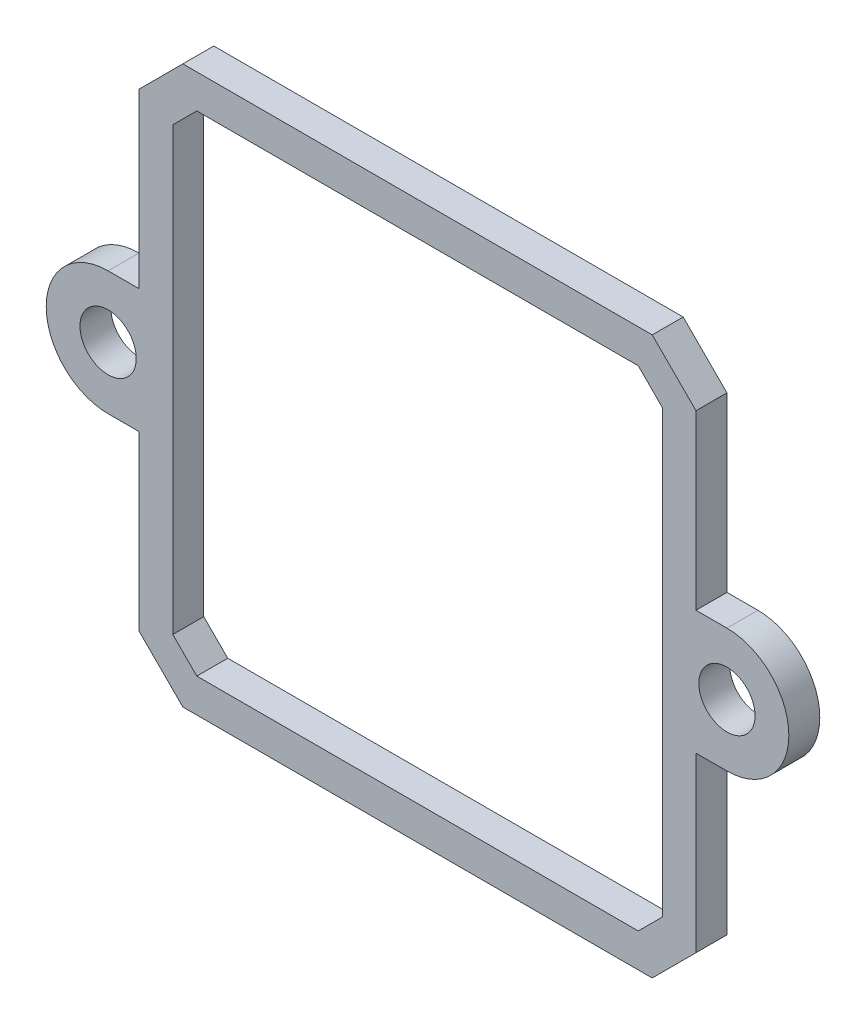
ISO-10303-21;
HEADER;
FILE_DESCRIPTION(('STEP AP214'),'2;1');
FILE_NAME('part.step','',(''),(''),'','','');
FILE_SCHEMA(('AUTOMOTIVE_DESIGN { 1 0 10303 214 1 1 1 1 }'));
ENDSEC;
DATA;
#1=APPLICATION_CONTEXT('core data for automotive mechanical design processes');
#2=APPLICATION_PROTOCOL_DEFINITION('international standard','automotive_design',2000,#1);
#3=PRODUCT_CONTEXT('',#1,'mechanical');
#4=PRODUCT('Part','Part','',(#3));
#5=PRODUCT_RELATED_PRODUCT_CATEGORY('part','',(#4));
#6=PRODUCT_DEFINITION_FORMATION('','',#4);
#7=PRODUCT_DEFINITION_CONTEXT('part definition',#1,'design');
#8=PRODUCT_DEFINITION('design','',#6,#7);
#9=PRODUCT_DEFINITION_SHAPE('','',#8);
#10=(LENGTH_UNIT() NAMED_UNIT(*) SI_UNIT(.MILLI.,.METRE.));
#11=(NAMED_UNIT(*) PLANE_ANGLE_UNIT() SI_UNIT($,.RADIAN.));
#12=(NAMED_UNIT(*) SI_UNIT($,.STERADIAN.) SOLID_ANGLE_UNIT());
#13=UNCERTAINTY_MEASURE_WITH_UNIT(LENGTH_MEASURE(1.E-05),#10,'distance_accuracy_value','');
#14=(GEOMETRIC_REPRESENTATION_CONTEXT(3) GLOBAL_UNCERTAINTY_ASSIGNED_CONTEXT((#13)) GLOBAL_UNIT_ASSIGNED_CONTEXT((#10,
#11,#12)) REPRESENTATION_CONTEXT('',''));
#15=CARTESIAN_POINT('',(0.,0.,0.));
#16=DIRECTION('',(0.,0.,1.));
#17=DIRECTION('',(1.,0.,0.));
#18=AXIS2_PLACEMENT_3D('',#15,#16,#17);
#19=CARTESIAN_POINT('',(0.,-9.9,1.1));
#20=DIRECTION('',(0.,1.,0.));
#21=DIRECTION('',(0.,0.,1.));
#22=AXIS2_PLACEMENT_3D('',#19,#20,#21);
#23=PLANE('',#22);
#24=DIRECTION('',(1.,0.,0.));
#25=VECTOR('',#24,1.);
#26=CARTESIAN_POINT('',(0.,-9.9,0.));
#27=LINE('',#26,#25);
#28=CARTESIAN_POINT('',(-8.34335495461292,-9.9,0.));
#29=VERTEX_POINT('',#28);
#30=CARTESIAN_POINT('',(8.34335495461292,-9.9,0.));
#31=VERTEX_POINT('',#30);
#32=EDGE_CURVE('E264',#29,#31,#27,.T.);
#33=ORIENTED_EDGE('',*,*,#32,.T.);
#34=DIRECTION('',(0.,0.,-1.));
#35=VECTOR('',#34,1.);
#36=CARTESIAN_POINT('',(8.34335495461292,-9.9,1.1));
#37=LINE('',#36,#35);
#38=CARTESIAN_POINT('',(8.34335495461292,-9.9,1.1));
#39=VERTEX_POINT('',#38);
#40=EDGE_CURVE('E11',#39,#31,#37,.T.);
#41=ORIENTED_EDGE('',*,*,#40,.F.);
#42=DIRECTION('',(1.,0.,0.));
#43=VECTOR('',#42,1.);
#44=CARTESIAN_POINT('',(0.,-9.9,1.1));
#45=LINE('',#44,#43);
#46=CARTESIAN_POINT('',(-8.34335495461292,-9.9,1.1));
#47=VERTEX_POINT('',#46);
#48=EDGE_CURVE('E386',#47,#39,#45,.T.);
#49=ORIENTED_EDGE('',*,*,#48,.F.);
#50=DIRECTION('',(0.,0.,-1.));
#51=VECTOR('',#50,1.);
#52=CARTESIAN_POINT('',(-8.34335495461292,-9.9,1.1));
#53=LINE('',#52,#51);
#54=EDGE_CURVE('E309',#47,#29,#53,.T.);
#55=ORIENTED_EDGE('',*,*,#54,.T.);
#56=EDGE_LOOP('',(#33,#41,#49,#55));
#57=FACE_BOUND('',#56,.T.);
#58=ADVANCED_FACE('F35',(#57),#23,.F.);
#59=CARTESIAN_POINT('',(9.12167747730646,-9.12167747730646,1.1));
#60=DIRECTION('',(-0.707106781186548,0.707106781186548,0.));
#61=DIRECTION('',(-0.707106781186548,-0.707106781186548,0.));
#62=AXIS2_PLACEMENT_3D('',#59,#60,#61);
#63=PLANE('',#62);
#64=DIRECTION('',(0.707106781186548,0.707106781186548,0.));
#65=VECTOR('',#64,1.);
#66=CARTESIAN_POINT('',(9.12167747730646,-9.12167747730646,0.));
#67=LINE('',#66,#65);
#68=CARTESIAN_POINT('',(9.9,-8.34335495461292,0.));
#69=VERTEX_POINT('',#68);
#70=EDGE_CURVE('E267',#31,#69,#67,.T.);
#71=ORIENTED_EDGE('',*,*,#70,.T.);
#72=DIRECTION('',(0.,0.,-1.));
#73=VECTOR('',#72,1.);
#74=CARTESIAN_POINT('',(9.9,-8.34335495461292,1.1));
#75=LINE('',#74,#73);
#76=CARTESIAN_POINT('',(9.9,-8.34335495461292,1.1));
#77=VERTEX_POINT('',#76);
#78=EDGE_CURVE('E45',#77,#69,#75,.T.);
#79=ORIENTED_EDGE('',*,*,#78,.F.);
#80=DIRECTION('',(0.707106781186548,0.707106781186548,0.));
#81=VECTOR('',#80,1.);
#82=CARTESIAN_POINT('',(9.12167747730646,-9.12167747730646,1.1));
#83=LINE('',#82,#81);
#84=EDGE_CURVE('E388',#39,#77,#83,.T.);
#85=ORIENTED_EDGE('',*,*,#84,.F.);
#86=ORIENTED_EDGE('',*,*,#40,.T.);
#87=EDGE_LOOP('',(#71,#79,#85,#86));
#88=FACE_BOUND('',#87,.T.);
#89=ADVANCED_FACE('F443',(#88),#63,.F.);
#90=CARTESIAN_POINT('',(9.9,0.,1.1));
#91=DIRECTION('',(1.,0.,0.));
#92=DIRECTION('',(0.,0.,-1.));
#93=AXIS2_PLACEMENT_3D('',#90,#91,#92);
#94=PLANE('',#93);
#95=DIRECTION('',(0.,-1.,0.));
#96=VECTOR('',#95,1.);
#97=CARTESIAN_POINT('',(9.9,0.,0.));
#98=LINE('',#97,#96);
#99=CARTESIAN_POINT('',(9.9,-2.2,0.));
#100=VERTEX_POINT('',#99);
#101=EDGE_CURVE('E270',#100,#69,#98,.T.);
#102=ORIENTED_EDGE('',*,*,#101,.F.);
#103=DIRECTION('',(0.,0.,-1.));
#104=VECTOR('',#103,1.);
#105=CARTESIAN_POINT('',(9.9,-2.2,1.1));
#106=LINE('',#105,#104);
#107=CARTESIAN_POINT('',(9.9,-2.2,1.1));
#108=VERTEX_POINT('',#107);
#109=EDGE_CURVE('E332',#108,#100,#106,.T.);
#110=ORIENTED_EDGE('',*,*,#109,.F.);
#111=DIRECTION('',(0.,-1.,0.));
#112=VECTOR('',#111,1.);
#113=CARTESIAN_POINT('',(9.9,0.,1.1));
#114=LINE('',#113,#112);
#115=EDGE_CURVE('E390',#108,#77,#114,.T.);
#116=ORIENTED_EDGE('',*,*,#115,.T.);
#117=ORIENTED_EDGE('',*,*,#78,.T.);
#118=EDGE_LOOP('',(#102,#110,#116,#117));
#119=FACE_BOUND('',#118,.T.);
#120=ADVANCED_FACE('F448',(#119),#94,.T.);
#121=CARTESIAN_POINT('',(0.,-2.2,1.1));
#122=DIRECTION('',(0.,1.,0.));
#123=DIRECTION('',(0.,0.,1.));
#124=AXIS2_PLACEMENT_3D('',#121,#122,#123);
#125=PLANE('',#124);
#126=DIRECTION('',(1.,0.,0.));
#127=VECTOR('',#126,1.);
#128=CARTESIAN_POINT('',(0.,-2.2,0.));
#129=LINE('',#128,#127);
#130=CARTESIAN_POINT('',(11.,-2.2,0.));
#131=VERTEX_POINT('',#130);
#132=EDGE_CURVE('E273',#100,#131,#129,.T.);
#133=ORIENTED_EDGE('',*,*,#132,.T.);
#134=DIRECTION('',(0.,0.,-1.));
#135=VECTOR('',#134,1.);
#136=CARTESIAN_POINT('',(11.,-2.2,1.1));
#137=LINE('',#136,#135);
#138=CARTESIAN_POINT('',(11.,-2.2,1.1));
#139=VERTEX_POINT('',#138);
#140=EDGE_CURVE('E330',#139,#131,#137,.T.);
#141=ORIENTED_EDGE('',*,*,#140,.F.);
#142=DIRECTION('',(1.,0.,0.));
#143=VECTOR('',#142,1.);
#144=CARTESIAN_POINT('',(0.,-2.2,1.1));
#145=LINE('',#144,#143);
#146=EDGE_CURVE('E393',#108,#139,#145,.T.);
#147=ORIENTED_EDGE('',*,*,#146,.F.);
#148=ORIENTED_EDGE('',*,*,#109,.T.);
#149=EDGE_LOOP('',(#133,#141,#147,#148));
#150=FACE_BOUND('',#149,.T.);
#151=ADVANCED_FACE('F518',(#150),#125,.F.);
#152=CARTESIAN_POINT('',(11.,0.,1.1));
#153=DIRECTION('',(0.,0.,-1.));
#154=DIRECTION('',(-1.,0.,0.));
#155=AXIS2_PLACEMENT_3D('',#152,#153,#154);
#156=CYLINDRICAL_SURFACE('',#155,2.2);
#157=CARTESIAN_POINT('',(11.,0.,0.));
#158=DIRECTION('',(0.,0.,1.));
#159=DIRECTION('',(1.,0.,0.));
#160=AXIS2_PLACEMENT_3D('',#157,#158,#159);
#161=CIRCLE('',#160,2.2);
#162=CARTESIAN_POINT('',(11.,2.2,0.));
#163=VERTEX_POINT('',#162);
#164=EDGE_CURVE('E277',#163,#131,#161,.F.);
#165=ORIENTED_EDGE('',*,*,#164,.F.);
#166=DIRECTION('',(0.,0.,-1.));
#167=VECTOR('',#166,1.);
#168=CARTESIAN_POINT('',(11.,2.2,1.1));
#169=LINE('',#168,#167);
#170=CARTESIAN_POINT('',(11.,2.2,1.1));
#171=VERTEX_POINT('',#170);
#172=EDGE_CURVE('E328',#171,#163,#169,.T.);
#173=ORIENTED_EDGE('',*,*,#172,.F.);
#174=CARTESIAN_POINT('',(11.,0.,1.1));
#175=DIRECTION('',(0.,0.,1.));
#176=DIRECTION('',(1.,0.,0.));
#177=AXIS2_PLACEMENT_3D('',#174,#175,#176);
#178=CIRCLE('',#177,2.2);
#179=EDGE_CURVE('E396',#171,#139,#178,.F.);
#180=ORIENTED_EDGE('',*,*,#179,.T.);
#181=ORIENTED_EDGE('',*,*,#140,.T.);
#182=EDGE_LOOP('',(#165,#173,#180,#181));
#183=FACE_BOUND('',#182,.T.);
#184=ADVANCED_FACE('F513',(#183),#156,.T.);
#185=CARTESIAN_POINT('',(0.,2.2,1.1));
#186=DIRECTION('',(0.,1.,0.));
#187=DIRECTION('',(0.,0.,1.));
#188=AXIS2_PLACEMENT_3D('',#185,#186,#187);
#189=PLANE('',#188);
#190=DIRECTION('',(1.,0.,0.));
#191=VECTOR('',#190,1.);
#192=CARTESIAN_POINT('',(0.,2.2,0.));
#193=LINE('',#192,#191);
#194=CARTESIAN_POINT('',(9.9,2.2,0.));
#195=VERTEX_POINT('',#194);
#196=EDGE_CURVE('E280',#195,#163,#193,.T.);
#197=ORIENTED_EDGE('',*,*,#196,.F.);
#198=DIRECTION('',(0.,0.,-1.));
#199=VECTOR('',#198,1.);
#200=CARTESIAN_POINT('',(9.9,2.2,1.1));
#201=LINE('',#200,#199);
#202=CARTESIAN_POINT('',(9.9,2.2,1.1));
#203=VERTEX_POINT('',#202);
#204=EDGE_CURVE('E326',#203,#195,#201,.T.);
#205=ORIENTED_EDGE('',*,*,#204,.F.);
#206=DIRECTION('',(1.,0.,0.));
#207=VECTOR('',#206,1.);
#208=CARTESIAN_POINT('',(0.,2.2,1.1));
#209=LINE('',#208,#207);
#210=EDGE_CURVE('E399',#203,#171,#209,.T.);
#211=ORIENTED_EDGE('',*,*,#210,.T.);
#212=ORIENTED_EDGE('',*,*,#172,.T.);
#213=EDGE_LOOP('',(#197,#205,#211,#212));
#214=FACE_BOUND('',#213,.T.);
#215=ADVANCED_FACE('F508',(#214),#189,.T.);
#216=CARTESIAN_POINT('',(9.9,8.34335495461292,0.));
#217=VERTEX_POINT('',#216);
#218=EDGE_CURVE('E274',#217,#195,#98,.T.);
#219=ORIENTED_EDGE('',*,*,#218,.F.);
#220=DIRECTION('',(0.,0.,-1.));
#221=VECTOR('',#220,1.);
#222=CARTESIAN_POINT('',(9.9,8.34335495461292,1.1));
#223=LINE('',#222,#221);
#224=CARTESIAN_POINT('',(9.9,8.34335495461292,1.1));
#225=VERTEX_POINT('',#224);
#226=EDGE_CURVE('E324',#225,#217,#223,.T.);
#227=ORIENTED_EDGE('',*,*,#226,.F.);
#228=EDGE_CURVE('E394',#225,#203,#114,.T.);
#229=ORIENTED_EDGE('',*,*,#228,.T.);
#230=ORIENTED_EDGE('',*,*,#204,.T.);
#231=EDGE_LOOP('',(#219,#227,#229,#230));
#232=FACE_BOUND('',#231,.T.);
#233=ADVANCED_FACE('F504',(#232),#94,.T.);
#234=CARTESIAN_POINT('',(9.12167747730646,9.12167747730646,1.1));
#235=DIRECTION('',(0.707106781186548,0.707106781186548,0.));
#236=DIRECTION('',(-0.707106781186548,0.707106781186548,0.));
#237=AXIS2_PLACEMENT_3D('',#234,#235,#236);
#238=PLANE('',#237);
#239=DIRECTION('',(0.707106781186548,-0.707106781186548,0.));
#240=VECTOR('',#239,1.);
#241=CARTESIAN_POINT('',(9.12167747730646,9.12167747730646,0.));
#242=LINE('',#241,#240);
#243=CARTESIAN_POINT('',(8.34335495461292,9.9,0.));
#244=VERTEX_POINT('',#243);
#245=EDGE_CURVE('E283',#244,#217,#242,.T.);
#246=ORIENTED_EDGE('',*,*,#245,.F.);
#247=DIRECTION('',(0.,0.,-1.));
#248=VECTOR('',#247,1.);
#249=CARTESIAN_POINT('',(8.34335495461292,9.9,1.1));
#250=LINE('',#249,#248);
#251=CARTESIAN_POINT('',(8.34335495461292,9.9,1.1));
#252=VERTEX_POINT('',#251);
#253=EDGE_CURVE('E322',#252,#244,#250,.T.);
#254=ORIENTED_EDGE('',*,*,#253,.F.);
#255=DIRECTION('',(0.707106781186548,-0.707106781186548,0.));
#256=VECTOR('',#255,1.);
#257=CARTESIAN_POINT('',(9.12167747730646,9.12167747730646,1.1));
#258=LINE('',#257,#256);
#259=EDGE_CURVE('E402',#252,#225,#258,.T.);
#260=ORIENTED_EDGE('',*,*,#259,.T.);
#261=ORIENTED_EDGE('',*,*,#226,.T.);
#262=EDGE_LOOP('',(#246,#254,#260,#261));
#263=FACE_BOUND('',#262,.T.);
#264=ADVANCED_FACE('F499',(#263),#238,.T.);
#265=CARTESIAN_POINT('',(0.,9.9,1.1));
#266=DIRECTION('',(0.,1.,0.));
#267=DIRECTION('',(0.,0.,1.));
#268=AXIS2_PLACEMENT_3D('',#265,#266,#267);
#269=PLANE('',#268);
#270=DIRECTION('',(1.,0.,0.));
#271=VECTOR('',#270,1.);
#272=CARTESIAN_POINT('',(0.,9.9,0.));
#273=LINE('',#272,#271);
#274=CARTESIAN_POINT('',(-8.34335495461293,9.9,0.));
#275=VERTEX_POINT('',#274);
#276=EDGE_CURVE('E286',#275,#244,#273,.T.);
#277=ORIENTED_EDGE('',*,*,#276,.F.);
#278=DIRECTION('',(0.,0.,-1.));
#279=VECTOR('',#278,1.);
#280=CARTESIAN_POINT('',(-8.34335495461293,9.9,1.1));
#281=LINE('',#280,#279);
#282=CARTESIAN_POINT('',(-8.34335495461293,9.9,1.1));
#283=VERTEX_POINT('',#282);
#284=EDGE_CURVE('E320',#283,#275,#281,.T.);
#285=ORIENTED_EDGE('',*,*,#284,.F.);
#286=DIRECTION('',(1.,0.,0.));
#287=VECTOR('',#286,1.);
#288=CARTESIAN_POINT('',(0.,9.9,1.1));
#289=LINE('',#288,#287);
#290=EDGE_CURVE('E405',#283,#252,#289,.T.);
#291=ORIENTED_EDGE('',*,*,#290,.T.);
#292=ORIENTED_EDGE('',*,*,#253,.T.);
#293=EDGE_LOOP('',(#277,#285,#291,#292));
#294=FACE_BOUND('',#293,.T.);
#295=ADVANCED_FACE('F487',(#294),#269,.T.);
#296=CARTESIAN_POINT('',(-9.12167747730646,9.12167747730646,1.1));
#297=DIRECTION('',(-0.707106781186548,0.707106781186548,0.));
#298=DIRECTION('',(-0.707106781186548,-0.707106781186548,0.));
#299=AXIS2_PLACEMENT_3D('',#296,#297,#298);
#300=PLANE('',#299);
#301=DIRECTION('',(0.707106781186548,0.707106781186548,0.));
#302=VECTOR('',#301,1.);
#303=CARTESIAN_POINT('',(-9.12167747730646,9.12167747730646,0.));
#304=LINE('',#303,#302);
#305=CARTESIAN_POINT('',(-9.9,8.34335495461293,0.));
#306=VERTEX_POINT('',#305);
#307=EDGE_CURVE('E289',#306,#275,#304,.T.);
#308=ORIENTED_EDGE('',*,*,#307,.F.);
#309=DIRECTION('',(0.,0.,-1.));
#310=VECTOR('',#309,1.);
#311=CARTESIAN_POINT('',(-9.9,8.34335495461293,1.1));
#312=LINE('',#311,#310);
#313=CARTESIAN_POINT('',(-9.9,8.34335495461293,1.1));
#314=VERTEX_POINT('',#313);
#315=EDGE_CURVE('E318',#314,#306,#312,.T.);
#316=ORIENTED_EDGE('',*,*,#315,.F.);
#317=DIRECTION('',(0.707106781186548,0.707106781186548,0.));
#318=VECTOR('',#317,1.);
#319=CARTESIAN_POINT('',(-9.12167747730646,9.12167747730646,1.1));
#320=LINE('',#319,#318);
#321=EDGE_CURVE('E408',#314,#283,#320,.T.);
#322=ORIENTED_EDGE('',*,*,#321,.T.);
#323=ORIENTED_EDGE('',*,*,#284,.T.);
#324=EDGE_LOOP('',(#308,#316,#322,#323));
#325=FACE_BOUND('',#324,.T.);
#326=ADVANCED_FACE('F480',(#325),#300,.T.);
#327=CARTESIAN_POINT('',(-9.9,0.,1.1));
#328=DIRECTION('',(1.,0.,0.));
#329=DIRECTION('',(0.,0.,-1.));
#330=AXIS2_PLACEMENT_3D('',#327,#328,#329);
#331=PLANE('',#330);
#332=DIRECTION('',(0.,-1.,0.));
#333=VECTOR('',#332,1.);
#334=CARTESIAN_POINT('',(-9.9,0.,0.));
#335=LINE('',#334,#333);
#336=CARTESIAN_POINT('',(-9.9,2.2,0.));
#337=VERTEX_POINT('',#336);
#338=EDGE_CURVE('E292',#306,#337,#335,.T.);
#339=ORIENTED_EDGE('',*,*,#338,.T.);
#340=DIRECTION('',(0.,0.,-1.));
#341=VECTOR('',#340,1.);
#342=CARTESIAN_POINT('',(-9.9,2.2,1.1));
#343=LINE('',#342,#341);
#344=CARTESIAN_POINT('',(-9.9,2.2,1.1));
#345=VERTEX_POINT('',#344);
#346=EDGE_CURVE('E315',#345,#337,#343,.T.);
#347=ORIENTED_EDGE('',*,*,#346,.F.);
#348=DIRECTION('',(0.,-1.,0.));
#349=VECTOR('',#348,1.);
#350=CARTESIAN_POINT('',(-9.9,0.,1.1));
#351=LINE('',#350,#349);
#352=EDGE_CURVE('E221',#314,#345,#351,.T.);
#353=ORIENTED_EDGE('',*,*,#352,.F.);
#354=ORIENTED_EDGE('',*,*,#315,.T.);
#355=EDGE_LOOP('',(#339,#347,#353,#354));
#356=FACE_BOUND('',#355,.T.);
#357=ADVANCED_FACE('F474',(#356),#331,.F.);
#358=CARTESIAN_POINT('',(0.,2.2,1.1));
#359=DIRECTION('',(0.,-1.,0.));
#360=DIRECTION('',(0.,0.,-1.));
#361=AXIS2_PLACEMENT_3D('',#358,#359,#360);
#362=PLANE('',#361);
#363=DIRECTION('',(-1.,0.,0.));
#364=VECTOR('',#363,1.);
#365=CARTESIAN_POINT('',(0.,2.2,0.));
#366=LINE('',#365,#364);
#367=CARTESIAN_POINT('',(-11.0000002241671,2.2,0.));
#368=VERTEX_POINT('',#367);
#369=EDGE_CURVE('E294',#337,#368,#366,.T.);
#370=ORIENTED_EDGE('',*,*,#369,.T.);
#371=DIRECTION('',(0.,0.,-1.));
#372=VECTOR('',#371,1.);
#373=CARTESIAN_POINT('',(-11.0000002241671,2.2,1.1));
#374=LINE('',#373,#372);
#375=CARTESIAN_POINT('',(-11.0000002241671,2.2,1.1));
#376=VERTEX_POINT('',#375);
#377=EDGE_CURVE('E313',#376,#368,#374,.T.);
#378=ORIENTED_EDGE('',*,*,#377,.F.);
#379=DIRECTION('',(-1.,0.,0.));
#380=VECTOR('',#379,1.);
#381=CARTESIAN_POINT('',(0.,2.2,1.1));
#382=LINE('',#381,#380);
#383=EDGE_CURVE('E228',#345,#376,#382,.T.);
#384=ORIENTED_EDGE('',*,*,#383,.F.);
#385=ORIENTED_EDGE('',*,*,#346,.T.);
#386=EDGE_LOOP('',(#370,#378,#384,#385));
#387=FACE_BOUND('',#386,.T.);
#388=ADVANCED_FACE('F416',(#387),#362,.F.);
#389=CARTESIAN_POINT('',(-11.0000002241671,0.,1.1));
#390=DIRECTION('',(0.,0.,-1.));
#391=DIRECTION('',(-1.,0.,0.));
#392=AXIS2_PLACEMENT_3D('',#389,#390,#391);
#393=CYLINDRICAL_SURFACE('',#392,2.2);
#394=CARTESIAN_POINT('',(-11.0000002241671,0.,0.));
#395=DIRECTION('',(0.,0.,1.));
#396=DIRECTION('',(1.,0.,0.));
#397=AXIS2_PLACEMENT_3D('',#394,#395,#396);
#398=CIRCLE('',#397,2.2);
#399=CARTESIAN_POINT('',(-11.0000002241671,-2.2,0.));
#400=VERTEX_POINT('',#399);
#401=EDGE_CURVE('E297',#400,#368,#398,.F.);
#402=ORIENTED_EDGE('',*,*,#401,.F.);
#403=DIRECTION('',(0.,0.,-1.));
#404=VECTOR('',#403,1.);
#405=CARTESIAN_POINT('',(-11.0000002241671,-2.2,1.1));
#406=LINE('',#405,#404);
#407=CARTESIAN_POINT('',(-11.0000002241671,-2.2,1.1));
#408=VERTEX_POINT('',#407);
#409=EDGE_CURVE('E215',#408,#400,#406,.T.);
#410=ORIENTED_EDGE('',*,*,#409,.F.);
#411=CARTESIAN_POINT('',(-11.0000002241671,0.,1.1));
#412=DIRECTION('',(0.,0.,1.));
#413=DIRECTION('',(1.,0.,0.));
#414=AXIS2_PLACEMENT_3D('',#411,#412,#413);
#415=CIRCLE('',#414,2.2);
#416=EDGE_CURVE('E226',#408,#376,#415,.F.);
#417=ORIENTED_EDGE('',*,*,#416,.T.);
#418=ORIENTED_EDGE('',*,*,#377,.T.);
#419=EDGE_LOOP('',(#402,#410,#417,#418));
#420=FACE_BOUND('',#419,.T.);
#421=ADVANCED_FACE('F420',(#420),#393,.T.);
#422=CARTESIAN_POINT('',(0.,-2.2,1.1));
#423=DIRECTION('',(0.,-1.,0.));
#424=DIRECTION('',(0.,0.,-1.));
#425=AXIS2_PLACEMENT_3D('',#422,#423,#424);
#426=PLANE('',#425);
#427=DIRECTION('',(-1.,0.,0.));
#428=VECTOR('',#427,1.);
#429=CARTESIAN_POINT('',(0.,-2.2,0.));
#430=LINE('',#429,#428);
#431=CARTESIAN_POINT('',(-9.9,-2.2,0.));
#432=VERTEX_POINT('',#431);
#433=EDGE_CURVE('E214',#432,#400,#430,.T.);
#434=ORIENTED_EDGE('',*,*,#433,.F.);
#435=DIRECTION('',(0.,0.,-1.));
#436=VECTOR('',#435,1.);
#437=CARTESIAN_POINT('',(-9.9,-2.2,1.1));
#438=LINE('',#437,#436);
#439=CARTESIAN_POINT('',(-9.9,-2.2,1.1));
#440=VERTEX_POINT('',#439);
#441=EDGE_CURVE('E208',#440,#432,#438,.T.);
#442=ORIENTED_EDGE('',*,*,#441,.F.);
#443=DIRECTION('',(-1.,0.,0.));
#444=VECTOR('',#443,1.);
#445=CARTESIAN_POINT('',(0.,-2.2,1.1));
#446=LINE('',#445,#444);
#447=EDGE_CURVE('E212',#440,#408,#446,.T.);
#448=ORIENTED_EDGE('',*,*,#447,.T.);
#449=ORIENTED_EDGE('',*,*,#409,.T.);
#450=EDGE_LOOP('',(#434,#442,#448,#449));
#451=FACE_BOUND('',#450,.T.);
#452=ADVANCED_FACE('F210',(#451),#426,.T.);
#453=CARTESIAN_POINT('',(-9.9,-8.34335495461292,0.));
#454=VERTEX_POINT('',#453);
#455=EDGE_CURVE('E130',#432,#454,#335,.T.);
#456=ORIENTED_EDGE('',*,*,#455,.T.);
#457=DIRECTION('',(0.,0.,-1.));
#458=VECTOR('',#457,1.);
#459=CARTESIAN_POINT('',(-9.9,-8.34335495461292,1.1));
#460=LINE('',#459,#458);
#461=CARTESIAN_POINT('',(-9.9,-8.34335495461292,1.1));
#462=VERTEX_POINT('',#461);
#463=EDGE_CURVE('E216',#462,#454,#460,.T.);
#464=ORIENTED_EDGE('',*,*,#463,.F.);
#465=EDGE_CURVE('E218',#440,#462,#351,.T.);
#466=ORIENTED_EDGE('',*,*,#465,.F.);
#467=ORIENTED_EDGE('',*,*,#441,.T.);
#468=EDGE_LOOP('',(#456,#464,#466,#467));
#469=FACE_BOUND('',#468,.T.);
#470=ADVANCED_FACE('F219',(#469),#331,.F.);
#471=CARTESIAN_POINT('',(-8.27314933988262,8.2731493398826,1.1));
#472=DIRECTION('',(0.707106781186548,-0.707106781186547,0.));
#473=DIRECTION('',(0.707106781186547,0.707106781186548,0.));
#474=AXIS2_PLACEMENT_3D('',#471,#472,#473);
#475=PLANE('',#474);
#476=DIRECTION('',(-0.707106781186547,-0.707106781186548,0.));
#477=VECTOR('',#476,1.);
#478=CARTESIAN_POINT('',(-8.27314933988262,8.2731493398826,0.));
#479=LINE('',#478,#477);
#480=CARTESIAN_POINT('',(-7.84629867976522,8.7,0.));
#481=VERTEX_POINT('',#480);
#482=CARTESIAN_POINT('',(-8.7,7.84629867976521,0.));
#483=VERTEX_POINT('',#482);
#484=EDGE_CURVE('E240',#481,#483,#479,.T.);
#485=ORIENTED_EDGE('',*,*,#484,.F.);
#486=DIRECTION('',(0.,0.,-1.));
#487=VECTOR('',#486,1.);
#488=CARTESIAN_POINT('',(-7.84629867976522,8.7,1.1));
#489=LINE('',#488,#487);
#490=CARTESIAN_POINT('',(-7.84629867976522,8.7,1.1));
#491=VERTEX_POINT('',#490);
#492=EDGE_CURVE('E39',#491,#481,#489,.T.);
#493=ORIENTED_EDGE('',*,*,#492,.F.);
#494=DIRECTION('',(-0.707106781186547,-0.707106781186548,0.));
#495=VECTOR('',#494,1.);
#496=CARTESIAN_POINT('',(-8.27314933988262,8.2731493398826,1.1));
#497=LINE('',#496,#495);
#498=CARTESIAN_POINT('',(-8.7,7.84629867976521,1.1));
#499=VERTEX_POINT('',#498);
#500=EDGE_CURVE('E308',#491,#499,#497,.T.);
#501=ORIENTED_EDGE('',*,*,#500,.T.);
#502=DIRECTION('',(0.,0.,-1.));
#503=VECTOR('',#502,1.);
#504=CARTESIAN_POINT('',(-8.7,7.84629867976521,1.1));
#505=LINE('',#504,#503);
#506=EDGE_CURVE('E239',#499,#483,#505,.T.);
#507=ORIENTED_EDGE('',*,*,#506,.T.);
#508=EDGE_LOOP('',(#485,#493,#501,#507));
#509=FACE_BOUND('',#508,.T.);
#510=ADVANCED_FACE('F37',(#509),#475,.T.);
#511=CARTESIAN_POINT('',(0.,8.7,1.1));
#512=DIRECTION('',(0.,-1.,0.));
#513=DIRECTION('',(1.,0.,0.));
#514=AXIS2_PLACEMENT_3D('',#511,#512,#513);
#515=PLANE('',#514);
#516=DIRECTION('',(-1.,0.,0.));
#517=VECTOR('',#516,1.);
#518=CARTESIAN_POINT('',(0.,8.7,0.));
#519=LINE('',#518,#517);
#520=CARTESIAN_POINT('',(7.84629867976521,8.7,0.));
#521=VERTEX_POINT('',#520);
#522=EDGE_CURVE('E243',#521,#481,#519,.T.);
#523=ORIENTED_EDGE('',*,*,#522,.F.);
#524=DIRECTION('',(0.,0.,-1.));
#525=VECTOR('',#524,1.);
#526=CARTESIAN_POINT('',(7.84629867976521,8.7,1.1));
#527=LINE('',#526,#525);
#528=CARTESIAN_POINT('',(7.84629867976521,8.7,1.1));
#529=VERTEX_POINT('',#528);
#530=EDGE_CURVE('E345',#529,#521,#527,.T.);
#531=ORIENTED_EDGE('',*,*,#530,.F.);
#532=DIRECTION('',(-1.,0.,0.));
#533=VECTOR('',#532,1.);
#534=CARTESIAN_POINT('',(0.,8.7,1.1));
#535=LINE('',#534,#533);
#536=EDGE_CURVE('E354',#529,#491,#535,.T.);
#537=ORIENTED_EDGE('',*,*,#536,.T.);
#538=ORIENTED_EDGE('',*,*,#492,.T.);
#539=EDGE_LOOP('',(#523,#531,#537,#538));
#540=FACE_BOUND('',#539,.T.);
#541=ADVANCED_FACE('F352',(#540),#515,.T.);
#542=CARTESIAN_POINT('',(8.27314933988261,8.27314933988261,1.1));
#543=DIRECTION('',(-0.707106781186548,-0.707106781186548,0.));
#544=DIRECTION('',(0.707106781186548,-0.707106781186548,0.));
#545=AXIS2_PLACEMENT_3D('',#542,#543,#544);
#546=PLANE('',#545);
#547=DIRECTION('',(-0.707106781186548,0.707106781186548,0.));
#548=VECTOR('',#547,1.);
#549=CARTESIAN_POINT('',(8.27314933988261,8.27314933988261,0.));
#550=LINE('',#549,#548);
#551=CARTESIAN_POINT('',(8.7,7.84629867976521,0.));
#552=VERTEX_POINT('',#551);
#553=EDGE_CURVE('E246',#552,#521,#550,.T.);
#554=ORIENTED_EDGE('',*,*,#553,.F.);
#555=DIRECTION('',(0.,0.,-1.));
#556=VECTOR('',#555,1.);
#557=CARTESIAN_POINT('',(8.7,7.84629867976521,1.1));
#558=LINE('',#557,#556);
#559=CARTESIAN_POINT('',(8.7,7.84629867976521,1.1));
#560=VERTEX_POINT('',#559);
#561=EDGE_CURVE('E344',#560,#552,#558,.T.);
#562=ORIENTED_EDGE('',*,*,#561,.F.);
#563=DIRECTION('',(-0.707106781186548,0.707106781186548,0.));
#564=VECTOR('',#563,1.);
#565=CARTESIAN_POINT('',(8.27314933988261,8.27314933988261,1.1));
#566=LINE('',#565,#564);
#567=EDGE_CURVE('E362',#560,#529,#566,.T.);
#568=ORIENTED_EDGE('',*,*,#567,.T.);
#569=ORIENTED_EDGE('',*,*,#530,.T.);
#570=EDGE_LOOP('',(#554,#562,#568,#569));
#571=FACE_BOUND('',#570,.T.);
#572=ADVANCED_FACE('F360',(#571),#546,.T.);
#573=CARTESIAN_POINT('',(8.7,0.,1.1));
#574=DIRECTION('',(-1.,0.,0.));
#575=DIRECTION('',(0.,0.,1.));
#576=AXIS2_PLACEMENT_3D('',#573,#574,#575);
#577=PLANE('',#576);
#578=DIRECTION('',(0.,1.,0.));
#579=VECTOR('',#578,1.);
#580=CARTESIAN_POINT('',(8.7,0.,0.));
#581=LINE('',#580,#579);
#582=CARTESIAN_POINT('',(8.7,-7.84629867976522,0.));
#583=VERTEX_POINT('',#582);
#584=EDGE_CURVE('E249',#583,#552,#581,.T.);
#585=ORIENTED_EDGE('',*,*,#584,.F.);
#586=DIRECTION('',(0.,0.,-1.));
#587=VECTOR('',#586,1.);
#588=CARTESIAN_POINT('',(8.7,-7.84629867976522,1.1));
#589=LINE('',#588,#587);
#590=CARTESIAN_POINT('',(8.7,-7.84629867976522,1.1));
#591=VERTEX_POINT('',#590);
#592=EDGE_CURVE('E342',#591,#583,#589,.T.);
#593=ORIENTED_EDGE('',*,*,#592,.F.);
#594=DIRECTION('',(0.,1.,0.));
#595=VECTOR('',#594,1.);
#596=CARTESIAN_POINT('',(8.7,0.,1.1));
#597=LINE('',#596,#595);
#598=EDGE_CURVE('E368',#591,#560,#597,.T.);
#599=ORIENTED_EDGE('',*,*,#598,.T.);
#600=ORIENTED_EDGE('',*,*,#561,.T.);
#601=EDGE_LOOP('',(#585,#593,#599,#600));
#602=FACE_BOUND('',#601,.T.);
#603=ADVANCED_FACE('F371',(#602),#577,.T.);
#604=CARTESIAN_POINT('',(8.27314933988261,-8.27314933988261,1.1));
#605=DIRECTION('',(-0.707106781186548,0.707106781186548,0.));
#606=DIRECTION('',(-0.707106781186548,-0.707106781186548,0.));
#607=AXIS2_PLACEMENT_3D('',#604,#605,#606);
#608=PLANE('',#607);
#609=DIRECTION('',(0.707106781186548,0.707106781186548,0.));
#610=VECTOR('',#609,1.);
#611=CARTESIAN_POINT('',(8.27314933988261,-8.27314933988261,0.));
#612=LINE('',#611,#610);
#613=CARTESIAN_POINT('',(7.84629867976522,-8.7,0.));
#614=VERTEX_POINT('',#613);
#615=EDGE_CURVE('E252',#614,#583,#612,.T.);
#616=ORIENTED_EDGE('',*,*,#615,.F.);
#617=DIRECTION('',(0.,0.,-1.));
#618=VECTOR('',#617,1.);
#619=CARTESIAN_POINT('',(7.84629867976522,-8.7,1.1));
#620=LINE('',#619,#618);
#621=CARTESIAN_POINT('',(7.84629867976522,-8.7,1.1));
#622=VERTEX_POINT('',#621);
#623=EDGE_CURVE('E340',#622,#614,#620,.T.);
#624=ORIENTED_EDGE('',*,*,#623,.F.);
#625=DIRECTION('',(0.707106781186548,0.707106781186548,0.));
#626=VECTOR('',#625,1.);
#627=CARTESIAN_POINT('',(8.27314933988261,-8.27314933988261,1.1));
#628=LINE('',#627,#626);
#629=EDGE_CURVE('E372',#622,#591,#628,.T.);
#630=ORIENTED_EDGE('',*,*,#629,.T.);
#631=ORIENTED_EDGE('',*,*,#592,.T.);
#632=EDGE_LOOP('',(#616,#624,#630,#631));
#633=FACE_BOUND('',#632,.T.);
#634=ADVANCED_FACE('F459',(#633),#608,.T.);
#635=CARTESIAN_POINT('',(0.,-8.7,1.1));
#636=DIRECTION('',(0.,1.,0.));
#637=DIRECTION('',(0.,0.,1.));
#638=AXIS2_PLACEMENT_3D('',#635,#636,#637);
#639=PLANE('',#638);
#640=DIRECTION('',(1.,0.,0.));
#641=VECTOR('',#640,1.);
#642=CARTESIAN_POINT('',(0.,-8.7,0.));
#643=LINE('',#642,#641);
#644=CARTESIAN_POINT('',(-7.84629867976521,-8.7,0.));
#645=VERTEX_POINT('',#644);
#646=EDGE_CURVE('E255',#645,#614,#643,.T.);
#647=ORIENTED_EDGE('',*,*,#646,.F.);
#648=DIRECTION('',(0.,0.,-1.));
#649=VECTOR('',#648,1.);
#650=CARTESIAN_POINT('',(-7.84629867976521,-8.7,1.1));
#651=LINE('',#650,#649);
#652=CARTESIAN_POINT('',(-7.84629867976521,-8.7,1.1));
#653=VERTEX_POINT('',#652);
#654=EDGE_CURVE('E338',#653,#645,#651,.T.);
#655=ORIENTED_EDGE('',*,*,#654,.F.);
#656=DIRECTION('',(1.,0.,0.));
#657=VECTOR('',#656,1.);
#658=CARTESIAN_POINT('',(0.,-8.7,1.1));
#659=LINE('',#658,#657);
#660=EDGE_CURVE('E374',#653,#622,#659,.T.);
#661=ORIENTED_EDGE('',*,*,#660,.T.);
#662=ORIENTED_EDGE('',*,*,#623,.T.);
#663=EDGE_LOOP('',(#647,#655,#661,#662));
#664=FACE_BOUND('',#663,.T.);
#665=ADVANCED_FACE('F455',(#664),#639,.T.);
#666=CARTESIAN_POINT('',(-8.27314933988258,-8.27314933988264,1.1));
#667=DIRECTION('',(0.707106781186545,0.70710678118655,0.));
#668=DIRECTION('',(-0.70710678118655,0.707106781186545,0.));
#669=AXIS2_PLACEMENT_3D('',#666,#667,#668);
#670=PLANE('',#669);
#671=DIRECTION('',(0.70710678118655,-0.707106781186545,0.));
#672=VECTOR('',#671,1.);
#673=CARTESIAN_POINT('',(-8.27314933988258,-8.27314933988264,0.));
#674=LINE('',#673,#672);
#675=CARTESIAN_POINT('',(-8.7,-7.84629867976522,0.));
#676=VERTEX_POINT('',#675);
#677=EDGE_CURVE('E258',#676,#645,#674,.T.);
#678=ORIENTED_EDGE('',*,*,#677,.F.);
#679=DIRECTION('',(0.,0.,-1.));
#680=VECTOR('',#679,1.);
#681=CARTESIAN_POINT('',(-8.7,-7.84629867976522,1.1));
#682=LINE('',#681,#680);
#683=CARTESIAN_POINT('',(-8.7,-7.84629867976522,1.1));
#684=VERTEX_POINT('',#683);
#685=EDGE_CURVE('E336',#684,#676,#682,.T.);
#686=ORIENTED_EDGE('',*,*,#685,.F.);
#687=DIRECTION('',(0.70710678118655,-0.707106781186545,0.));
#688=VECTOR('',#687,1.);
#689=CARTESIAN_POINT('',(-8.27314933988258,-8.27314933988264,1.1));
#690=LINE('',#689,#688);
#691=EDGE_CURVE('E380',#684,#653,#690,.T.);
#692=ORIENTED_EDGE('',*,*,#691,.T.);
#693=ORIENTED_EDGE('',*,*,#654,.T.);
#694=EDGE_LOOP('',(#678,#686,#692,#693));
#695=FACE_BOUND('',#694,.T.);
#696=ADVANCED_FACE('F438',(#695),#670,.T.);
#697=CARTESIAN_POINT('',(-11.0000002241671,0.,1.1));
#698=DIRECTION('',(0.,0.,-1.));
#699=DIRECTION('',(-1.,0.,0.));
#700=AXIS2_PLACEMENT_3D('',#697,#698,#699);
#701=CYLINDRICAL_SURFACE('',#700,1.);
#702=CARTESIAN_POINT('',(-11.0000002241671,0.,1.1));
#703=DIRECTION('',(0.,0.,1.));
#704=DIRECTION('',(1.,0.,0.));
#705=AXIS2_PLACEMENT_3D('',#702,#703,#704);
#706=CIRCLE('',#705,1.);
#707=CARTESIAN_POINT('',(-10.0000002241671,0.,1.1));
#708=VERTEX_POINT('',#707);
#709=EDGE_CURVE('E233',#708,#708,#706,.T.);
#710=ORIENTED_EDGE('',*,*,#709,.T.);
#711=EDGE_LOOP('',(#710));
#712=FACE_BOUND('',#711,.T.);
#713=CARTESIAN_POINT('',(-11.0000002241671,0.,0.));
#714=DIRECTION('',(0.,0.,1.));
#715=DIRECTION('',(1.,0.,0.));
#716=AXIS2_PLACEMENT_3D('',#713,#714,#715);
#717=CIRCLE('',#716,1.);
#718=CARTESIAN_POINT('',(-10.0000002241671,0.,0.));
#719=VERTEX_POINT('',#718);
#720=EDGE_CURVE('E302',#719,#719,#717,.T.);
#721=ORIENTED_EDGE('',*,*,#720,.F.);
#722=EDGE_LOOP('',(#721));
#723=FACE_BOUND('',#722,.T.);
#724=ADVANCED_FACE('F429',(#712,#723),#701,.F.);
#725=CARTESIAN_POINT('',(-9.12167747730646,-9.12167747730647,1.1));
#726=DIRECTION('',(0.707106781186547,0.707106781186548,0.));
#727=DIRECTION('',(-0.707106781186548,0.707106781186547,0.));
#728=AXIS2_PLACEMENT_3D('',#725,#726,#727);
#729=PLANE('',#728);
#730=DIRECTION('',(0.707106781186548,-0.707106781186547,0.));
#731=VECTOR('',#730,1.);
#732=CARTESIAN_POINT('',(-9.12167747730646,-9.12167747730647,0.));
#733=LINE('',#732,#731);
#734=EDGE_CURVE('E136',#454,#29,#733,.T.);
#735=ORIENTED_EDGE('',*,*,#734,.T.);
#736=ORIENTED_EDGE('',*,*,#54,.F.);
#737=DIRECTION('',(0.707106781186548,-0.707106781186547,0.));
#738=VECTOR('',#737,1.);
#739=CARTESIAN_POINT('',(-9.12167747730646,-9.12167747730647,1.1));
#740=LINE('',#739,#738);
#741=EDGE_CURVE('E54',#462,#47,#740,.T.);
#742=ORIENTED_EDGE('',*,*,#741,.F.);
#743=ORIENTED_EDGE('',*,*,#463,.T.);
#744=EDGE_LOOP('',(#735,#736,#742,#743));
#745=FACE_BOUND('',#744,.T.);
#746=ADVANCED_FACE('F426',(#745),#729,.F.);
#747=CARTESIAN_POINT('',(-8.7,0.,1.1));
#748=DIRECTION('',(1.,0.,0.));
#749=DIRECTION('',(0.,1.,0.));
#750=AXIS2_PLACEMENT_3D('',#747,#748,#749);
#751=PLANE('',#750);
#752=DIRECTION('',(0.,-1.,0.));
#753=VECTOR('',#752,1.);
#754=CARTESIAN_POINT('',(-8.7,0.,0.));
#755=LINE('',#754,#753);
#756=EDGE_CURVE('E261',#483,#676,#755,.T.);
#757=ORIENTED_EDGE('',*,*,#756,.F.);
#758=ORIENTED_EDGE('',*,*,#506,.F.);
#759=DIRECTION('',(0.,-1.,0.));
#760=VECTOR('',#759,1.);
#761=CARTESIAN_POINT('',(-8.7,0.,1.1));
#762=LINE('',#761,#760);
#763=EDGE_CURVE('E383',#499,#684,#762,.T.);
#764=ORIENTED_EDGE('',*,*,#763,.T.);
#765=ORIENTED_EDGE('',*,*,#685,.T.);
#766=EDGE_LOOP('',(#757,#758,#764,#765));
#767=FACE_BOUND('',#766,.T.);
#768=ADVANCED_FACE('F428',(#767),#751,.T.);
#769=CARTESIAN_POINT('',(11.,0.,1.1));
#770=DIRECTION('',(0.,0.,-1.));
#771=DIRECTION('',(-1.,0.,0.));
#772=AXIS2_PLACEMENT_3D('',#769,#770,#771);
#773=CYLINDRICAL_SURFACE('',#772,1.);
#774=CARTESIAN_POINT('',(11.,0.,1.1));
#775=DIRECTION('',(0.,0.,1.));
#776=DIRECTION('',(1.,0.,0.));
#777=AXIS2_PLACEMENT_3D('',#774,#775,#776);
#778=CIRCLE('',#777,1.);
#779=CARTESIAN_POINT('',(12.,0.,1.1));
#780=VERTEX_POINT('',#779);
#781=EDGE_CURVE('E236',#780,#780,#778,.T.);
#782=ORIENTED_EDGE('',*,*,#781,.T.);
#783=EDGE_LOOP('',(#782));
#784=FACE_BOUND('',#783,.T.);
#785=CARTESIAN_POINT('',(11.,0.,0.));
#786=DIRECTION('',(0.,0.,1.));
#787=DIRECTION('',(1.,0.,0.));
#788=AXIS2_PLACEMENT_3D('',#785,#786,#787);
#789=CIRCLE('',#788,1.);
#790=CARTESIAN_POINT('',(12.,0.,0.));
#791=VERTEX_POINT('',#790);
#792=EDGE_CURVE('E305',#791,#791,#789,.T.);
#793=ORIENTED_EDGE('',*,*,#792,.F.);
#794=EDGE_LOOP('',(#793));
#795=FACE_BOUND('',#794,.T.);
#796=ADVANCED_FACE('F435',(#784,#795),#773,.F.);
#797=CARTESIAN_POINT('',(0.,0.,1.1));
#798=DIRECTION('',(0.,0.,1.));
#799=DIRECTION('',(1.,0.,0.));
#800=AXIS2_PLACEMENT_3D('',#797,#798,#799);
#801=PLANE('',#800);
#802=ORIENTED_EDGE('',*,*,#500,.F.);
#803=ORIENTED_EDGE('',*,*,#536,.F.);
#804=ORIENTED_EDGE('',*,*,#567,.F.);
#805=ORIENTED_EDGE('',*,*,#598,.F.);
#806=ORIENTED_EDGE('',*,*,#629,.F.);
#807=ORIENTED_EDGE('',*,*,#660,.F.);
#808=ORIENTED_EDGE('',*,*,#691,.F.);
#809=ORIENTED_EDGE('',*,*,#763,.F.);
#810=EDGE_LOOP('',(#802,#803,#804,#805,#806,#807,#808,#809));
#811=FACE_BOUND('',#810,.T.);
#812=ORIENTED_EDGE('',*,*,#48,.T.);
#813=ORIENTED_EDGE('',*,*,#84,.T.);
#814=ORIENTED_EDGE('',*,*,#115,.F.);
#815=ORIENTED_EDGE('',*,*,#146,.T.);
#816=ORIENTED_EDGE('',*,*,#179,.F.);
#817=ORIENTED_EDGE('',*,*,#210,.F.);
#818=ORIENTED_EDGE('',*,*,#228,.F.);
#819=ORIENTED_EDGE('',*,*,#259,.F.);
#820=ORIENTED_EDGE('',*,*,#290,.F.);
#821=ORIENTED_EDGE('',*,*,#321,.F.);
#822=ORIENTED_EDGE('',*,*,#352,.T.);
#823=ORIENTED_EDGE('',*,*,#383,.T.);
#824=ORIENTED_EDGE('',*,*,#416,.F.);
#825=ORIENTED_EDGE('',*,*,#447,.F.);
#826=ORIENTED_EDGE('',*,*,#465,.T.);
#827=ORIENTED_EDGE('',*,*,#741,.T.);
#828=EDGE_LOOP('',(#812,#813,#814,#815,#816,#817,#818,#819,#820,#821,#822,#823,#824,#825,#826,#827));
#829=FACE_BOUND('',#828,.T.);
#830=ORIENTED_EDGE('',*,*,#709,.F.);
#831=EDGE_LOOP('',(#830));
#832=FACE_BOUND('',#831,.T.);
#833=ORIENTED_EDGE('',*,*,#781,.F.);
#834=EDGE_LOOP('',(#833));
#835=FACE_BOUND('',#834,.T.);
#836=ADVANCED_FACE('F223',(#811,#829,#832,#835),#801,.T.);
#837=CARTESIAN_POINT('',(0.,0.,0.));
#838=DIRECTION('',(0.,0.,1.));
#839=DIRECTION('',(1.,0.,0.));
#840=AXIS2_PLACEMENT_3D('',#837,#838,#839);
#841=PLANE('',#840);
#842=ORIENTED_EDGE('',*,*,#484,.T.);
#843=ORIENTED_EDGE('',*,*,#756,.T.);
#844=ORIENTED_EDGE('',*,*,#677,.T.);
#845=ORIENTED_EDGE('',*,*,#646,.T.);
#846=ORIENTED_EDGE('',*,*,#615,.T.);
#847=ORIENTED_EDGE('',*,*,#584,.T.);
#848=ORIENTED_EDGE('',*,*,#553,.T.);
#849=ORIENTED_EDGE('',*,*,#522,.T.);
#850=EDGE_LOOP('',(#842,#843,#844,#845,#846,#847,#848,#849));
#851=FACE_BOUND('',#850,.T.);
#852=ORIENTED_EDGE('',*,*,#32,.F.);
#853=ORIENTED_EDGE('',*,*,#734,.F.);
#854=ORIENTED_EDGE('',*,*,#455,.F.);
#855=ORIENTED_EDGE('',*,*,#433,.T.);
#856=ORIENTED_EDGE('',*,*,#401,.T.);
#857=ORIENTED_EDGE('',*,*,#369,.F.);
#858=ORIENTED_EDGE('',*,*,#338,.F.);
#859=ORIENTED_EDGE('',*,*,#307,.T.);
#860=ORIENTED_EDGE('',*,*,#276,.T.);
#861=ORIENTED_EDGE('',*,*,#245,.T.);
#862=ORIENTED_EDGE('',*,*,#218,.T.);
#863=ORIENTED_EDGE('',*,*,#196,.T.);
#864=ORIENTED_EDGE('',*,*,#164,.T.);
#865=ORIENTED_EDGE('',*,*,#132,.F.);
#866=ORIENTED_EDGE('',*,*,#101,.T.);
#867=ORIENTED_EDGE('',*,*,#70,.F.);
#868=EDGE_LOOP('',(#852,#853,#854,#855,#856,#857,#858,#859,#860,#861,#862,#863,#864,#865,#866,#867));
#869=FACE_BOUND('',#868,.T.);
#870=ORIENTED_EDGE('',*,*,#720,.T.);
#871=EDGE_LOOP('',(#870));
#872=FACE_BOUND('',#871,.T.);
#873=ORIENTED_EDGE('',*,*,#792,.T.);
#874=EDGE_LOOP('',(#873));
#875=FACE_BOUND('',#874,.T.);
#876=ADVANCED_FACE('F357',(#851,#869,#872,#875),#841,.F.);
#877=CLOSED_SHELL('',(#58,#89,#120,#151,#184,#215,#233,#264,#295,#326,#357,#388,#421,#452,#470,
#510,#541,#572,#603,#634,#665,#696,#724,#746,#768,#796,#836,#876));
#878=MANIFOLD_SOLID_BREP('B2',#877);
#879=ADVANCED_BREP_SHAPE_REPRESENTATION('',(#18,#878),#14);
#880=SHAPE_DEFINITION_REPRESENTATION(#9,#879);
ENDSEC;
END-ISO-10303-21;
